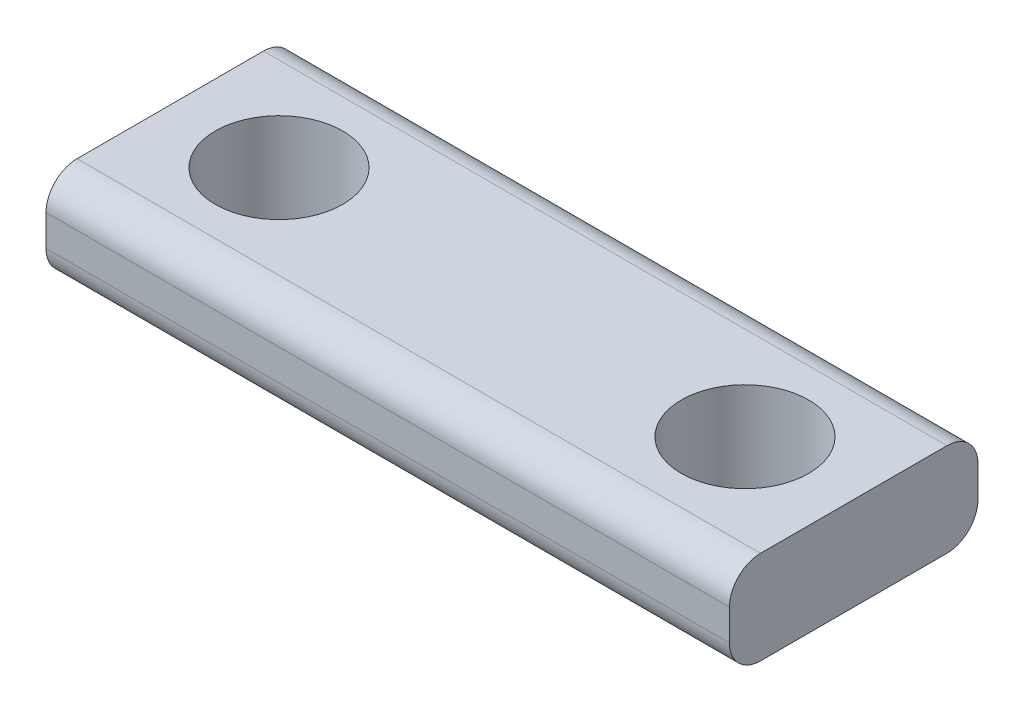
ISO-10303-21;
HEADER;
FILE_DESCRIPTION(('STEP AP214'),'2;1');
FILE_NAME('part.step','',(''),(''),'','','');
FILE_SCHEMA(('AUTOMOTIVE_DESIGN { 1 0 10303 214 1 1 1 1 }'));
ENDSEC;
DATA;
#1=APPLICATION_CONTEXT('core data for automotive mechanical design processes');
#2=APPLICATION_PROTOCOL_DEFINITION('international standard','automotive_design',2000,#1);
#3=PRODUCT_CONTEXT('',#1,'mechanical');
#4=PRODUCT('Part','Part','',(#3));
#5=PRODUCT_RELATED_PRODUCT_CATEGORY('part','',(#4));
#6=PRODUCT_DEFINITION_FORMATION('','',#4);
#7=PRODUCT_DEFINITION_CONTEXT('part definition',#1,'design');
#8=PRODUCT_DEFINITION('design','',#6,#7);
#9=PRODUCT_DEFINITION_SHAPE('','',#8);
#10=(LENGTH_UNIT() NAMED_UNIT(*) SI_UNIT(.MILLI.,.METRE.));
#11=(NAMED_UNIT(*) PLANE_ANGLE_UNIT() SI_UNIT($,.RADIAN.));
#12=(NAMED_UNIT(*) SI_UNIT($,.STERADIAN.) SOLID_ANGLE_UNIT());
#13=UNCERTAINTY_MEASURE_WITH_UNIT(LENGTH_MEASURE(1.E-05),#10,'distance_accuracy_value','');
#14=(GEOMETRIC_REPRESENTATION_CONTEXT(3) GLOBAL_UNCERTAINTY_ASSIGNED_CONTEXT((#13)) GLOBAL_UNIT_ASSIGNED_CONTEXT((#10,
#11,#12)) REPRESENTATION_CONTEXT('',''));
#15=CARTESIAN_POINT('',(0.,0.,0.));
#16=DIRECTION('',(0.,0.,1.));
#17=DIRECTION('',(1.,0.,0.));
#18=AXIS2_PLACEMENT_3D('',#15,#16,#17);
#19=CARTESIAN_POINT('',(7.7715611723761E-13,2.99999999999978,-8.00000000000045));
#20=DIRECTION('',(0.,-1.,0.));
#21=DIRECTION('',(0.,0.,-1.));
#22=AXIS2_PLACEMENT_3D('',#19,#20,#21);
#23=PLANE('',#22);
#24=CARTESIAN_POINT('',(3.50000000000084,3.00000000000017,-4.00000000000045));
#25=DIRECTION('',(0.,1.,0.));
#26=DIRECTION('',(0.,0.,1.));
#27=AXIS2_PLACEMENT_3D('',#24,#25,#26);
#28=CIRCLE('',#27,2.05);
#29=CARTESIAN_POINT('',(3.50000000000084,3.00000000000017,-1.95000000000045));
#30=VERTEX_POINT('',#29);
#31=EDGE_CURVE('E162',#30,#30,#28,.T.);
#32=ORIENTED_EDGE('',*,*,#31,.F.);
#33=EDGE_LOOP('',(#32));
#34=FACE_BOUND('',#33,.T.);
#35=DIRECTION('',(0.,0.,-1.));
#36=VECTOR('',#35,1.);
#37=CARTESIAN_POINT('',(22.0000000000008,3.0000000000002,-4.44089209850063E-13));
#38=LINE('',#37,#36);
#39=CARTESIAN_POINT('',(22.0000000000008,3.,-1.00000000000044));
#40=VERTEX_POINT('',#39);
#41=CARTESIAN_POINT('',(22.0000000000008,2.99999999999978,-7.00000000000045));
#42=VERTEX_POINT('',#41);
#43=EDGE_CURVE('E104',#40,#42,#38,.T.);
#44=ORIENTED_EDGE('',*,*,#43,.T.);
#45=DIRECTION('',(-1.,0.,0.));
#46=VECTOR('',#45,1.);
#47=CARTESIAN_POINT('',(7.7715611723761E-13,3.00000000000017,-7.00000000000045));
#48=LINE('',#47,#46);
#49=CARTESIAN_POINT('',(7.7715611723761E-13,3.00000000000017,-7.00000000000045));
#50=VERTEX_POINT('',#49);
#51=EDGE_CURVE('E11',#42,#50,#48,.T.);
#52=ORIENTED_EDGE('',*,*,#51,.T.);
#53=DIRECTION('',(0.,0.,1.));
#54=VECTOR('',#53,1.);
#55=CARTESIAN_POINT('',(7.7715611723761E-13,3.,-4.44089209850063E-13));
#56=LINE('',#55,#54);
#57=CARTESIAN_POINT('',(7.7715611723761E-13,2.99999999999961,-1.00000000000044));
#58=VERTEX_POINT('',#57);
#59=EDGE_CURVE('E149',#50,#58,#56,.T.);
#60=ORIENTED_EDGE('',*,*,#59,.T.);
#61=DIRECTION('',(1.,0.,0.));
#62=VECTOR('',#61,1.);
#63=CARTESIAN_POINT('',(7.7715611723761E-13,2.99999999999961,-1.00000000000044));
#64=LINE('',#63,#62);
#65=EDGE_CURVE('E40',#58,#40,#64,.T.);
#66=ORIENTED_EDGE('',*,*,#65,.T.);
#67=EDGE_LOOP('',(#44,#52,#60,#66));
#68=FACE_BOUND('',#67,.T.);
#69=CARTESIAN_POINT('',(18.5000000000007,3.,-4.00000000000045));
#70=DIRECTION('',(0.,1.,0.));
#71=DIRECTION('',(0.,0.,1.));
#72=AXIS2_PLACEMENT_3D('',#69,#70,#71);
#73=CIRCLE('',#72,2.05);
#74=CARTESIAN_POINT('',(18.5000000000007,3.,-1.95000000000045));
#75=VERTEX_POINT('',#74);
#76=EDGE_CURVE('E225',#75,#75,#73,.T.);
#77=ORIENTED_EDGE('',*,*,#76,.F.);
#78=EDGE_LOOP('',(#77));
#79=FACE_BOUND('',#78,.T.);
#80=ADVANCED_FACE('F32',(#34,#68,#79),#23,.F.);
#81=CARTESIAN_POINT('',(0.,-2.22044604925031E-13,-8.00000000000001));
#82=DIRECTION('',(0.,-1.,0.));
#83=DIRECTION('',(0.,0.,-1.));
#84=AXIS2_PLACEMENT_3D('',#81,#82,#83);
#85=PLANE('',#84);
#86=CARTESIAN_POINT('',(3.50000000000006,3.88578058618805E-13,-4.));
#87=DIRECTION('',(0.,1.,0.));
#88=DIRECTION('',(0.,0.,1.));
#89=AXIS2_PLACEMENT_3D('',#86,#87,#88);
#90=CIRCLE('',#89,2.05);
#91=CARTESIAN_POINT('',(3.50000000000006,3.88578058618805E-13,-1.95));
#92=VERTEX_POINT('',#91);
#93=EDGE_CURVE('E158',#92,#92,#90,.T.);
#94=ORIENTED_EDGE('',*,*,#93,.T.);
#95=EDGE_LOOP('',(#94));
#96=FACE_BOUND('',#95,.T.);
#97=DIRECTION('',(0.,0.,-1.));
#98=VECTOR('',#97,1.);
#99=CARTESIAN_POINT('',(22.,1.94289029309402E-13,0.));
#100=LINE('',#99,#98);
#101=CARTESIAN_POINT('',(22.,0.,-1.));
#102=VERTEX_POINT('',#101);
#103=CARTESIAN_POINT('',(22.,-2.22044604925031E-13,-7.00000000000001));
#104=VERTEX_POINT('',#103);
#105=EDGE_CURVE('E150',#102,#104,#100,.T.);
#106=ORIENTED_EDGE('',*,*,#105,.F.);
#107=DIRECTION('',(1.,0.,0.));
#108=VECTOR('',#107,1.);
#109=CARTESIAN_POINT('',(0.,-3.60822483003176E-13,-1.));
#110=LINE('',#109,#108);
#111=CARTESIAN_POINT('',(0.,-3.60822483003176E-13,-1.));
#112=VERTEX_POINT('',#111);
#113=EDGE_CURVE('E135',#102,#112,#110,.F.);
#114=ORIENTED_EDGE('',*,*,#113,.T.);
#115=DIRECTION('',(0.,0.,1.));
#116=VECTOR('',#115,1.);
#117=CARTESIAN_POINT('',(0.,0.,0.));
#118=LINE('',#117,#116);
#119=CARTESIAN_POINT('',(0.,1.66533453693773E-13,-7.00000000000001));
#120=VERTEX_POINT('',#119);
#121=EDGE_CURVE('E155',#120,#112,#118,.T.);
#122=ORIENTED_EDGE('',*,*,#121,.F.);
#123=DIRECTION('',(-1.,0.,0.));
#124=VECTOR('',#123,1.);
#125=CARTESIAN_POINT('',(22.,-2.22044604925031E-13,-7.00000000000001));
#126=LINE('',#125,#124);
#127=EDGE_CURVE('E133',#120,#104,#126,.F.);
#128=ORIENTED_EDGE('',*,*,#127,.T.);
#129=EDGE_LOOP('',(#106,#114,#122,#128));
#130=FACE_BOUND('',#129,.T.);
#131=CARTESIAN_POINT('',(18.5,3.88578058618805E-13,-4.));
#132=DIRECTION('',(0.,1.,0.));
#133=DIRECTION('',(0.,0.,1.));
#134=AXIS2_PLACEMENT_3D('',#131,#132,#133);
#135=CIRCLE('',#134,2.05);
#136=CARTESIAN_POINT('',(18.5,3.88578058618805E-13,-1.95));
#137=VERTEX_POINT('',#136);
#138=EDGE_CURVE('E228',#137,#137,#135,.T.);
#139=ORIENTED_EDGE('',*,*,#138,.T.);
#140=EDGE_LOOP('',(#139));
#141=FACE_BOUND('',#140,.T.);
#142=ADVANCED_FACE('F176',(#96,#130,#141),#85,.T.);
#143=CARTESIAN_POINT('',(7.7715611723761E-13,3.,-4.44089209850063E-13));
#144=DIRECTION('',(1.,0.,0.));
#145=DIRECTION('',(0.,0.,-1.));
#146=AXIS2_PLACEMENT_3D('',#143,#144,#145);
#147=PLANE('',#146);
#148=ORIENTED_EDGE('',*,*,#121,.T.);
#149=CARTESIAN_POINT('',(0.,0.999999999999612,-1.00000000000044));
#150=DIRECTION('',(1.,0.,0.));
#151=DIRECTION('',(0.,0.,-1.));
#152=AXIS2_PLACEMENT_3D('',#149,#150,#151);
#153=CIRCLE('',#152,1.);
#154=CARTESIAN_POINT('',(0.,1.,-4.44089209850063E-13));
#155=VERTEX_POINT('',#154);
#156=EDGE_CURVE('E140',#112,#155,#153,.F.);
#157=ORIENTED_EDGE('',*,*,#156,.T.);
#158=DIRECTION('',(0.,-1.,0.));
#159=VECTOR('',#158,1.);
#160=CARTESIAN_POINT('',(7.7715611723761E-13,3.,-4.44089209850063E-13));
#161=LINE('',#160,#159);
#162=CARTESIAN_POINT('',(7.7715611723761E-13,2.,-4.44089209850063E-13));
#163=VERTEX_POINT('',#162);
#164=EDGE_CURVE('E119',#163,#155,#161,.T.);
#165=ORIENTED_EDGE('',*,*,#164,.F.);
#166=CARTESIAN_POINT('',(7.7715611723761E-13,1.99999999999961,-1.00000000000044));
#167=DIRECTION('',(1.,0.,0.));
#168=DIRECTION('',(0.,0.,-1.));
#169=AXIS2_PLACEMENT_3D('',#166,#167,#168);
#170=CIRCLE('',#169,1.);
#171=EDGE_CURVE('E123',#163,#58,#170,.F.);
#172=ORIENTED_EDGE('',*,*,#171,.T.);
#173=ORIENTED_EDGE('',*,*,#59,.F.);
#174=CARTESIAN_POINT('',(7.7715611723761E-13,2.00000000000017,-7.00000000000045));
#175=DIRECTION('',(1.,0.,0.));
#176=DIRECTION('',(0.,0.,-1.));
#177=AXIS2_PLACEMENT_3D('',#174,#175,#176);
#178=CIRCLE('',#177,1.);
#179=CARTESIAN_POINT('',(7.7715611723761E-13,1.99999999999978,-8.00000000000045));
#180=VERTEX_POINT('',#179);
#181=EDGE_CURVE('E55',#50,#180,#178,.F.);
#182=ORIENTED_EDGE('',*,*,#181,.T.);
#183=DIRECTION('',(0.,-1.,0.));
#184=VECTOR('',#183,1.);
#185=CARTESIAN_POINT('',(7.7715611723761E-13,2.99999999999978,-8.00000000000045));
#186=LINE('',#185,#184);
#187=CARTESIAN_POINT('',(0.,0.999999999999779,-8.00000000000045));
#188=VERTEX_POINT('',#187);
#189=EDGE_CURVE('E152',#180,#188,#186,.T.);
#190=ORIENTED_EDGE('',*,*,#189,.T.);
#191=CARTESIAN_POINT('',(0.,1.00000000000017,-7.00000000000045));
#192=DIRECTION('',(1.,0.,0.));
#193=DIRECTION('',(0.,0.,-1.));
#194=AXIS2_PLACEMENT_3D('',#191,#192,#193);
#195=CIRCLE('',#194,1.);
#196=EDGE_CURVE('E47',#188,#120,#195,.F.);
#197=ORIENTED_EDGE('',*,*,#196,.T.);
#198=EDGE_LOOP('',(#148,#157,#165,#172,#173,#182,#190,#197));
#199=FACE_BOUND('',#198,.T.);
#200=ADVANCED_FACE('F182',(#199),#147,.F.);
#201=CARTESIAN_POINT('',(7.7715611723761E-13,3.,-4.44089209850063E-13));
#202=DIRECTION('',(0.,0.,-1.));
#203=DIRECTION('',(-1.,0.,0.));
#204=AXIS2_PLACEMENT_3D('',#201,#202,#203);
#205=PLANE('',#204);
#206=ORIENTED_EDGE('',*,*,#164,.T.);
#207=DIRECTION('',(1.,0.,0.));
#208=VECTOR('',#207,1.);
#209=CARTESIAN_POINT('',(22.,1.0000000000002,-4.44089209850063E-13));
#210=LINE('',#209,#208);
#211=CARTESIAN_POINT('',(22.,1.0000000000002,-4.44089209850063E-13));
#212=VERTEX_POINT('',#211);
#213=EDGE_CURVE('E110',#155,#212,#210,.T.);
#214=ORIENTED_EDGE('',*,*,#213,.T.);
#215=DIRECTION('',(0.,-1.,0.));
#216=VECTOR('',#215,1.);
#217=CARTESIAN_POINT('',(22.0000000000008,3.0000000000002,-4.44089209850063E-13));
#218=LINE('',#217,#216);
#219=CARTESIAN_POINT('',(22.0000000000008,2.0000000000002,-4.44089209850063E-13));
#220=VERTEX_POINT('',#219);
#221=EDGE_CURVE('E102',#220,#212,#218,.T.);
#222=ORIENTED_EDGE('',*,*,#221,.F.);
#223=DIRECTION('',(1.,0.,0.));
#224=VECTOR('',#223,1.);
#225=CARTESIAN_POINT('',(7.7715611723761E-13,2.,-4.44089209850063E-13));
#226=LINE('',#225,#224);
#227=EDGE_CURVE('E116',#220,#163,#226,.F.);
#228=ORIENTED_EDGE('',*,*,#227,.T.);
#229=EDGE_LOOP('',(#206,#214,#222,#228));
#230=FACE_BOUND('',#229,.T.);
#231=ADVANCED_FACE('F115',(#230),#205,.F.);
#232=CARTESIAN_POINT('',(22.0000000000008,3.0000000000002,-4.44089209850063E-13));
#233=DIRECTION('',(-1.,0.,0.));
#234=DIRECTION('',(0.,0.,1.));
#235=AXIS2_PLACEMENT_3D('',#232,#233,#234);
#236=PLANE('',#235);
#237=ORIENTED_EDGE('',*,*,#221,.T.);
#238=CARTESIAN_POINT('',(22.,1.,-1.00000000000044));
#239=DIRECTION('',(-1.,0.,0.));
#240=DIRECTION('',(0.,0.,1.));
#241=AXIS2_PLACEMENT_3D('',#238,#239,#240);
#242=CIRCLE('',#241,1.);
#243=EDGE_CURVE('E131',#212,#102,#242,.F.);
#244=ORIENTED_EDGE('',*,*,#243,.T.);
#245=ORIENTED_EDGE('',*,*,#105,.T.);
#246=CARTESIAN_POINT('',(22.,0.999999999999779,-7.00000000000045));
#247=DIRECTION('',(-1.,0.,0.));
#248=DIRECTION('',(0.,0.,1.));
#249=AXIS2_PLACEMENT_3D('',#246,#247,#248);
#250=CIRCLE('',#249,1.);
#251=CARTESIAN_POINT('',(22.,1.,-8.00000000000045));
#252=VERTEX_POINT('',#251);
#253=EDGE_CURVE('E129',#104,#252,#250,.F.);
#254=ORIENTED_EDGE('',*,*,#253,.T.);
#255=DIRECTION('',(0.,-1.,0.));
#256=VECTOR('',#255,1.);
#257=CARTESIAN_POINT('',(22.0000000000008,3.,-8.00000000000045));
#258=LINE('',#257,#256);
#259=CARTESIAN_POINT('',(22.0000000000008,2.,-8.00000000000045));
#260=VERTEX_POINT('',#259);
#261=EDGE_CURVE('E120',#260,#252,#258,.T.);
#262=ORIENTED_EDGE('',*,*,#261,.F.);
#263=CARTESIAN_POINT('',(22.0000000000008,1.99999999999978,-7.00000000000045));
#264=DIRECTION('',(-1.,0.,0.));
#265=DIRECTION('',(0.,0.,1.));
#266=AXIS2_PLACEMENT_3D('',#263,#264,#265);
#267=CIRCLE('',#266,1.);
#268=EDGE_CURVE('E109',#260,#42,#267,.F.);
#269=ORIENTED_EDGE('',*,*,#268,.T.);
#270=ORIENTED_EDGE('',*,*,#43,.F.);
#271=CARTESIAN_POINT('',(22.0000000000008,2.,-1.00000000000044));
#272=DIRECTION('',(-1.,0.,0.));
#273=DIRECTION('',(0.,0.,1.));
#274=AXIS2_PLACEMENT_3D('',#271,#272,#273);
#275=CIRCLE('',#274,1.);
#276=EDGE_CURVE('E99',#40,#220,#275,.F.);
#277=ORIENTED_EDGE('',*,*,#276,.T.);
#278=EDGE_LOOP('',(#237,#244,#245,#254,#262,#269,#270,#277));
#279=FACE_BOUND('',#278,.T.);
#280=ADVANCED_FACE('F101',(#279),#236,.F.);
#281=CARTESIAN_POINT('',(7.7715611723761E-13,2.99999999999978,-8.00000000000045));
#282=DIRECTION('',(0.,0.,1.));
#283=DIRECTION('',(1.,0.,0.));
#284=AXIS2_PLACEMENT_3D('',#281,#282,#283);
#285=PLANE('',#284);
#286=ORIENTED_EDGE('',*,*,#261,.T.);
#287=DIRECTION('',(-1.,0.,0.));
#288=VECTOR('',#287,1.);
#289=CARTESIAN_POINT('',(0.,0.999999999999779,-8.00000000000045));
#290=LINE('',#289,#288);
#291=EDGE_CURVE('E144',#252,#188,#290,.T.);
#292=ORIENTED_EDGE('',*,*,#291,.T.);
#293=ORIENTED_EDGE('',*,*,#189,.F.);
#294=DIRECTION('',(-1.,0.,0.));
#295=VECTOR('',#294,1.);
#296=CARTESIAN_POINT('',(7.7715611723761E-13,1.99999999999978,-8.00000000000045));
#297=LINE('',#296,#295);
#298=EDGE_CURVE('E142',#180,#260,#297,.F.);
#299=ORIENTED_EDGE('',*,*,#298,.T.);
#300=EDGE_LOOP('',(#286,#292,#293,#299));
#301=FACE_BOUND('',#300,.T.);
#302=ADVANCED_FACE('F168',(#301),#285,.F.);
#303=CARTESIAN_POINT('',(3.50000000000084,3.00000000000017,-4.00000000000045));
#304=DIRECTION('',(0.,-1.,0.));
#305=DIRECTION('',(0.,0.,-1.));
#306=AXIS2_PLACEMENT_3D('',#303,#304,#305);
#307=CYLINDRICAL_SURFACE('',#306,2.05);
#308=ORIENTED_EDGE('',*,*,#31,.T.);
#309=EDGE_LOOP('',(#308));
#310=FACE_BOUND('',#309,.T.);
#311=ORIENTED_EDGE('',*,*,#93,.F.);
#312=EDGE_LOOP('',(#311));
#313=FACE_BOUND('',#312,.T.);
#314=ADVANCED_FACE('F201',(#310,#313),#307,.F.);
#315=CARTESIAN_POINT('',(18.5000000000007,3.,-4.00000000000045));
#316=DIRECTION('',(0.,-1.,0.));
#317=DIRECTION('',(0.,0.,-1.));
#318=AXIS2_PLACEMENT_3D('',#315,#316,#317);
#319=CYLINDRICAL_SURFACE('',#318,2.05);
#320=ORIENTED_EDGE('',*,*,#76,.T.);
#321=EDGE_LOOP('',(#320));
#322=FACE_BOUND('',#321,.T.);
#323=ORIENTED_EDGE('',*,*,#138,.F.);
#324=EDGE_LOOP('',(#323));
#325=FACE_BOUND('',#324,.T.);
#326=ADVANCED_FACE('F213',(#322,#325),#319,.F.);
#327=CARTESIAN_POINT('',(0.,0.999999999999612,-1.00000000000044));
#328=DIRECTION('',(-1.,0.,0.));
#329=DIRECTION('',(0.,0.,1.));
#330=AXIS2_PLACEMENT_3D('',#327,#328,#329);
#331=CYLINDRICAL_SURFACE('',#330,1.);
#332=ORIENTED_EDGE('',*,*,#156,.F.);
#333=ORIENTED_EDGE('',*,*,#113,.F.);
#334=ORIENTED_EDGE('',*,*,#243,.F.);
#335=ORIENTED_EDGE('',*,*,#213,.F.);
#336=EDGE_LOOP('',(#332,#333,#334,#335));
#337=FACE_BOUND('',#336,.T.);
#338=ADVANCED_FACE('F181',(#337),#331,.T.);
#339=CARTESIAN_POINT('',(0.,1.00000000000017,-7.00000000000045));
#340=DIRECTION('',(1.,0.,0.));
#341=DIRECTION('',(0.,0.,-1.));
#342=AXIS2_PLACEMENT_3D('',#339,#340,#341);
#343=CYLINDRICAL_SURFACE('',#342,1.);
#344=ORIENTED_EDGE('',*,*,#253,.F.);
#345=ORIENTED_EDGE('',*,*,#127,.F.);
#346=ORIENTED_EDGE('',*,*,#196,.F.);
#347=ORIENTED_EDGE('',*,*,#291,.F.);
#348=EDGE_LOOP('',(#344,#345,#346,#347));
#349=FACE_BOUND('',#348,.T.);
#350=ADVANCED_FACE('F172',(#349),#343,.T.);
#351=CARTESIAN_POINT('',(7.7715611723761E-13,2.00000000000017,-7.00000000000045));
#352=DIRECTION('',(-1.,0.,0.));
#353=DIRECTION('',(0.,0.,1.));
#354=AXIS2_PLACEMENT_3D('',#351,#352,#353);
#355=CYLINDRICAL_SURFACE('',#354,1.);
#356=ORIENTED_EDGE('',*,*,#268,.F.);
#357=ORIENTED_EDGE('',*,*,#298,.F.);
#358=ORIENTED_EDGE('',*,*,#181,.F.);
#359=ORIENTED_EDGE('',*,*,#51,.F.);
#360=EDGE_LOOP('',(#356,#357,#358,#359));
#361=FACE_BOUND('',#360,.T.);
#362=ADVANCED_FACE('F184',(#361),#355,.T.);
#363=CARTESIAN_POINT('',(7.7715611723761E-13,1.99999999999961,-1.00000000000044));
#364=DIRECTION('',(1.,0.,0.));
#365=DIRECTION('',(0.,0.,-1.));
#366=AXIS2_PLACEMENT_3D('',#363,#364,#365);
#367=CYLINDRICAL_SURFACE('',#366,1.);
#368=ORIENTED_EDGE('',*,*,#171,.F.);
#369=ORIENTED_EDGE('',*,*,#227,.F.);
#370=ORIENTED_EDGE('',*,*,#276,.F.);
#371=ORIENTED_EDGE('',*,*,#65,.F.);
#372=EDGE_LOOP('',(#368,#369,#370,#371));
#373=FACE_BOUND('',#372,.T.);
#374=ADVANCED_FACE('F34',(#373),#367,.T.);
#375=CLOSED_SHELL('',(#80,#142,#200,#231,#280,#302,#314,#326,#338,#350,#362,#374));
#376=MANIFOLD_SOLID_BREP('B2',#375);
#377=ADVANCED_BREP_SHAPE_REPRESENTATION('',(#18,#376),#14);
#378=SHAPE_DEFINITION_REPRESENTATION(#9,#377);
ENDSEC;
END-ISO-10303-21;
